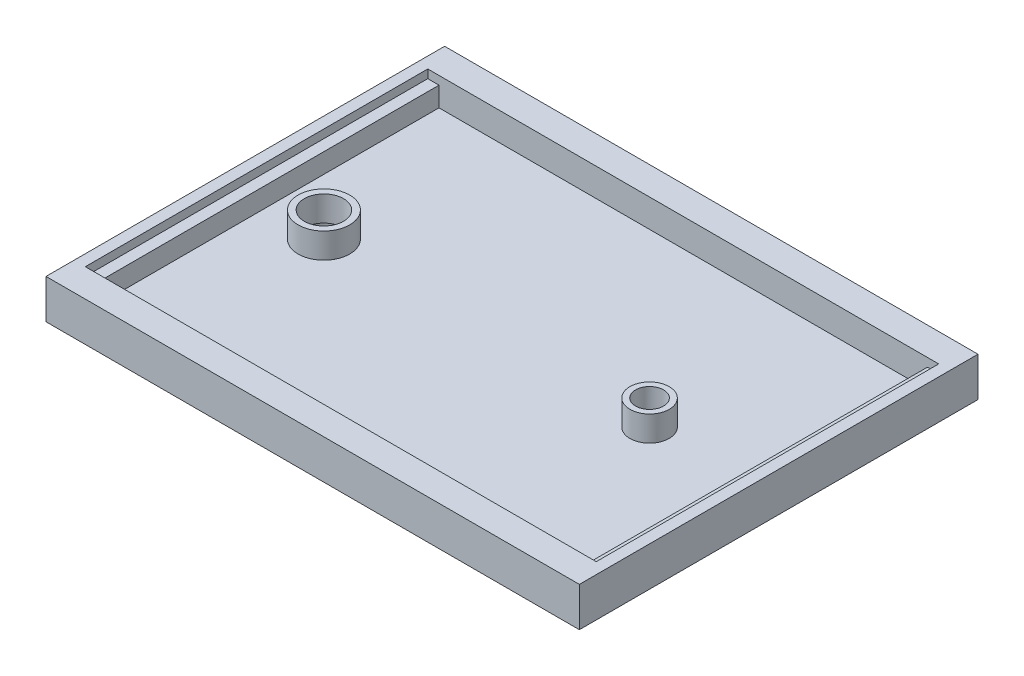
ISO-10303-21;
HEADER;
FILE_DESCRIPTION(('STEP AP214'),'2;1');
FILE_NAME('part.step','',(''),(''),'','','');
FILE_SCHEMA(('AUTOMOTIVE_DESIGN { 1 0 10303 214 1 1 1 1 }'));
ENDSEC;
DATA;
#1=APPLICATION_CONTEXT('core data for automotive mechanical design processes');
#2=APPLICATION_PROTOCOL_DEFINITION('international standard','automotive_design',2000,#1);
#3=PRODUCT_CONTEXT('',#1,'mechanical');
#4=PRODUCT('Part','Part','',(#3));
#5=PRODUCT_RELATED_PRODUCT_CATEGORY('part','',(#4));
#6=PRODUCT_DEFINITION_FORMATION('','',#4);
#7=PRODUCT_DEFINITION_CONTEXT('part definition',#1,'design');
#8=PRODUCT_DEFINITION('design','',#6,#7);
#9=PRODUCT_DEFINITION_SHAPE('','',#8);
#10=(LENGTH_UNIT() NAMED_UNIT(*) SI_UNIT(.MILLI.,.METRE.));
#11=(NAMED_UNIT(*) PLANE_ANGLE_UNIT() SI_UNIT($,.RADIAN.));
#12=(NAMED_UNIT(*) SI_UNIT($,.STERADIAN.) SOLID_ANGLE_UNIT());
#13=UNCERTAINTY_MEASURE_WITH_UNIT(LENGTH_MEASURE(1.E-05),#10,'distance_accuracy_value','');
#14=(GEOMETRIC_REPRESENTATION_CONTEXT(3) GLOBAL_UNCERTAINTY_ASSIGNED_CONTEXT((#13)) GLOBAL_UNIT_ASSIGNED_CONTEXT((#10,
#11,#12)) REPRESENTATION_CONTEXT('',''));
#15=CARTESIAN_POINT('',(0.,0.,0.));
#16=DIRECTION('',(0.,0.,1.));
#17=DIRECTION('',(1.,0.,0.));
#18=AXIS2_PLACEMENT_3D('',#15,#16,#17);
#19=CARTESIAN_POINT('',(-33.5,-0.5,0.));
#20=DIRECTION('',(0.,1.,0.));
#21=DIRECTION('',(0.,0.,1.));
#22=AXIS2_PLACEMENT_3D('',#19,#20,#21);
#23=PLANE('',#22);
#24=CARTESIAN_POINT('',(-33.5,-0.5,0.));
#25=DIRECTION('',(0.,1.,0.));
#26=DIRECTION('',(0.,0.,1.));
#27=AXIS2_PLACEMENT_3D('',#24,#25,#26);
#28=CIRCLE('',#27,4.6);
#29=CARTESIAN_POINT('',(-33.5,-0.5,4.6));
#30=VERTEX_POINT('',#29);
#31=EDGE_CURVE('E12',#30,#30,#28,.T.);
#32=ORIENTED_EDGE('',*,*,#31,.T.);
#33=EDGE_LOOP('',(#32));
#34=FACE_BOUND('',#33,.T.);
#35=CARTESIAN_POINT('',(-33.5,-0.5,0.));
#36=DIRECTION('',(0.,1.,0.));
#37=DIRECTION('',(0.,0.,1.));
#38=AXIS2_PLACEMENT_3D('',#35,#36,#37);
#39=CIRCLE('',#38,3.5);
#40=CARTESIAN_POINT('',(-33.5,-0.5,3.5));
#41=VERTEX_POINT('',#40);
#42=EDGE_CURVE('E107',#41,#41,#39,.T.);
#43=ORIENTED_EDGE('',*,*,#42,.F.);
#44=EDGE_LOOP('',(#43));
#45=FACE_BOUND('',#44,.T.);
#46=ADVANCED_FACE('F93',(#34,#45),#23,.T.);
#47=CARTESIAN_POINT('',(-33.5,-5.,0.));
#48=DIRECTION('',(0.,1.,0.));
#49=DIRECTION('',(0.,0.,1.));
#50=AXIS2_PLACEMENT_3D('',#47,#48,#49);
#51=PLANE('',#50);
#52=CARTESIAN_POINT('',(-33.5,-5.,0.));
#53=DIRECTION('',(0.,1.,0.));
#54=DIRECTION('',(0.,0.,1.));
#55=AXIS2_PLACEMENT_3D('',#52,#53,#54);
#56=CIRCLE('',#55,4.6);
#57=CARTESIAN_POINT('',(-33.5,-5.,4.6));
#58=VERTEX_POINT('',#57);
#59=EDGE_CURVE('E97',#58,#58,#56,.T.);
#60=ORIENTED_EDGE('',*,*,#59,.F.);
#61=EDGE_LOOP('',(#60));
#62=FACE_BOUND('',#61,.T.);
#63=CARTESIAN_POINT('',(-33.5,-5.,0.));
#64=DIRECTION('',(0.,1.,0.));
#65=DIRECTION('',(0.,0.,1.));
#66=AXIS2_PLACEMENT_3D('',#63,#64,#65);
#67=CIRCLE('',#66,3.5);
#68=CARTESIAN_POINT('',(-33.5,-5.,3.5));
#69=VERTEX_POINT('',#68);
#70=EDGE_CURVE('E109',#69,#69,#67,.T.);
#71=ORIENTED_EDGE('',*,*,#70,.T.);
#72=EDGE_LOOP('',(#71));
#73=FACE_BOUND('',#72,.T.);
#74=ADVANCED_FACE('F122',(#62,#73),#51,.F.);
#75=CARTESIAN_POINT('',(-33.5,-0.5,0.));
#76=DIRECTION('',(0.,-1.,0.));
#77=DIRECTION('',(0.,0.,-1.));
#78=AXIS2_PLACEMENT_3D('',#75,#76,#77);
#79=CYLINDRICAL_SURFACE('',#78,4.6);
#80=ORIENTED_EDGE('',*,*,#31,.F.);
#81=EDGE_LOOP('',(#80));
#82=FACE_BOUND('',#81,.T.);
#83=ORIENTED_EDGE('',*,*,#59,.T.);
#84=EDGE_LOOP('',(#83));
#85=FACE_BOUND('',#84,.T.);
#86=ADVANCED_FACE('F95',(#82,#85),#79,.T.);
#87=CARTESIAN_POINT('',(-33.5,-0.5,0.));
#88=DIRECTION('',(0.,-1.,0.));
#89=DIRECTION('',(0.,0.,-1.));
#90=AXIS2_PLACEMENT_3D('',#87,#88,#89);
#91=CYLINDRICAL_SURFACE('',#90,3.5);
#92=ORIENTED_EDGE('',*,*,#42,.T.);
#93=EDGE_LOOP('',(#92));
#94=FACE_BOUND('',#93,.T.);
#95=ORIENTED_EDGE('',*,*,#70,.F.);
#96=EDGE_LOOP('',(#95));
#97=FACE_BOUND('',#96,.T.);
#98=ADVANCED_FACE('F118',(#94,#97),#91,.F.);
#99=CLOSED_SHELL('',(#46,#74,#86,#98));
#100=MANIFOLD_SOLID_BREP('B2',#99);
#101=CARTESIAN_POINT('',(-43.5,-5.,30.5));
#102=DIRECTION('',(0.,-1.,0.));
#103=DIRECTION('',(0.,0.,-1.));
#104=AXIS2_PLACEMENT_3D('',#101,#102,#103);
#105=PLANE('',#104);
#106=DIRECTION('',(-1.,0.,0.));
#107=VECTOR('',#106,1.);
#108=CARTESIAN_POINT('',(-43.5,-5.,-30.5));
#109=LINE('',#108,#107);
#110=CARTESIAN_POINT('',(43.5,-5.,-30.5));
#111=VERTEX_POINT('',#110);
#112=CARTESIAN_POINT('',(-43.5,-5.,-30.5));
#113=VERTEX_POINT('',#112);
#114=EDGE_CURVE('E351',#111,#113,#109,.T.);
#115=ORIENTED_EDGE('',*,*,#114,.T.);
#116=DIRECTION('',(0.,0.,-1.));
#117=VECTOR('',#116,1.);
#118=CARTESIAN_POINT('',(-43.5,-5.,30.5));
#119=LINE('',#118,#117);
#120=CARTESIAN_POINT('',(-43.5,-5.,30.5));
#121=VERTEX_POINT('',#120);
#122=EDGE_CURVE('E374',#121,#113,#119,.T.);
#123=ORIENTED_EDGE('',*,*,#122,.F.);
#124=DIRECTION('',(-1.,0.,0.));
#125=VECTOR('',#124,1.);
#126=CARTESIAN_POINT('',(-43.5,-5.,30.5));
#127=LINE('',#126,#125);
#128=CARTESIAN_POINT('',(43.5,-5.,30.5));
#129=VERTEX_POINT('',#128);
#130=EDGE_CURVE('E323',#129,#121,#127,.T.);
#131=ORIENTED_EDGE('',*,*,#130,.F.);
#132=DIRECTION('',(0.,0.,-1.));
#133=VECTOR('',#132,1.);
#134=CARTESIAN_POINT('',(43.5,-5.,30.5));
#135=LINE('',#134,#133);
#136=EDGE_CURVE('E378',#129,#111,#135,.T.);
#137=ORIENTED_EDGE('',*,*,#136,.T.);
#138=EDGE_LOOP('',(#115,#123,#131,#137));
#139=FACE_BOUND('',#138,.T.);
#140=CARTESIAN_POINT('',(-33.5,-5.,0.));
#141=DIRECTION('',(0.,-1.,0.));
#142=DIRECTION('',(0.,0.,-1.));
#143=AXIS2_PLACEMENT_3D('',#140,#141,#142);
#144=CIRCLE('',#143,4.6);
#145=CARTESIAN_POINT('',(-33.5,-5.,-4.6));
#146=VERTEX_POINT('',#145);
#147=EDGE_CURVE('E292',#146,#146,#144,.T.);
#148=ORIENTED_EDGE('',*,*,#147,.T.);
#149=EDGE_LOOP('',(#148));
#150=FACE_BOUND('',#149,.T.);
#151=CARTESIAN_POINT('',(24.5,-5.,0.));
#152=DIRECTION('',(0.,-1.,0.));
#153=DIRECTION('',(0.,0.,-1.));
#154=AXIS2_PLACEMENT_3D('',#151,#152,#153);
#155=CIRCLE('',#154,3.5);
#156=CARTESIAN_POINT('',(24.5,-5.,-3.5));
#157=VERTEX_POINT('',#156);
#158=EDGE_CURVE('E91',#157,#157,#155,.F.);
#159=ORIENTED_EDGE('',*,*,#158,.F.);
#160=EDGE_LOOP('',(#159));
#161=FACE_BOUND('',#160,.T.);
#162=ADVANCED_FACE('F163',(#139,#150,#161),#105,.F.);
#163=CARTESIAN_POINT('',(-47.5,-7.,30.5));
#164=DIRECTION('',(1.,0.,0.));
#165=DIRECTION('',(0.,0.,-1.));
#166=AXIS2_PLACEMENT_3D('',#163,#164,#165);
#167=PLANE('',#166);
#168=DIRECTION('',(0.,0.,-1.));
#169=VECTOR('',#168,1.);
#170=CARTESIAN_POINT('',(-47.5,0.,30.5));
#171=LINE('',#170,#169);
#172=CARTESIAN_POINT('',(-47.5,0.,35.5));
#173=VERTEX_POINT('',#172);
#174=CARTESIAN_POINT('',(-47.5,0.,-35.5));
#175=VERTEX_POINT('',#174);
#176=EDGE_CURVE('E173',#173,#175,#171,.T.);
#177=ORIENTED_EDGE('',*,*,#176,.T.);
#178=DIRECTION('',(0.,-1.,0.));
#179=VECTOR('',#178,1.);
#180=CARTESIAN_POINT('',(-47.5,0.,-35.5));
#181=LINE('',#180,#179);
#182=CARTESIAN_POINT('',(-47.5,-7.,-35.5));
#183=VERTEX_POINT('',#182);
#184=EDGE_CURVE('E273',#175,#183,#181,.T.);
#185=ORIENTED_EDGE('',*,*,#184,.T.);
#186=DIRECTION('',(0.,0.,-1.));
#187=VECTOR('',#186,1.);
#188=CARTESIAN_POINT('',(-47.5,-7.,30.5));
#189=LINE('',#188,#187);
#190=CARTESIAN_POINT('',(-47.5,-7.,35.5));
#191=VERTEX_POINT('',#190);
#192=EDGE_CURVE('E395',#191,#183,#189,.T.);
#193=ORIENTED_EDGE('',*,*,#192,.F.);
#194=DIRECTION('',(0.,-1.,0.));
#195=VECTOR('',#194,1.);
#196=CARTESIAN_POINT('',(-47.5,0.,35.5));
#197=LINE('',#196,#195);
#198=EDGE_CURVE('E295',#173,#191,#197,.T.);
#199=ORIENTED_EDGE('',*,*,#198,.F.);
#200=EDGE_LOOP('',(#177,#185,#193,#199));
#201=FACE_BOUND('',#200,.T.);
#202=ADVANCED_FACE('F165',(#201),#167,.F.);
#203=CARTESIAN_POINT('',(-47.5,-7.,30.5));
#204=DIRECTION('',(0.,1.,0.));
#205=DIRECTION('',(-1.,0.,0.));
#206=AXIS2_PLACEMENT_3D('',#203,#204,#205);
#207=PLANE('',#206);
#208=CARTESIAN_POINT('',(-33.5,-7.,0.));
#209=DIRECTION('',(0.,-1.,0.));
#210=DIRECTION('',(1.,0.,0.));
#211=AXIS2_PLACEMENT_3D('',#208,#209,#210);
#212=CIRCLE('',#211,4.6);
#213=CARTESIAN_POINT('',(-28.9,-7.,0.));
#214=VERTEX_POINT('',#213);
#215=EDGE_CURVE('E401',#214,#214,#212,.T.);
#216=ORIENTED_EDGE('',*,*,#215,.F.);
#217=EDGE_LOOP('',(#216));
#218=FACE_BOUND('',#217,.T.);
#219=CARTESIAN_POINT('',(24.5,-6.99999999999999,0.));
#220=DIRECTION('',(0.,-1.,0.));
#221=DIRECTION('',(1.,0.,0.));
#222=AXIS2_PLACEMENT_3D('',#219,#220,#221);
#223=CIRCLE('',#222,2.5);
#224=CARTESIAN_POINT('',(27.,-6.99999999999999,0.));
#225=VERTEX_POINT('',#224);
#226=EDGE_CURVE('E408',#225,#225,#223,.T.);
#227=ORIENTED_EDGE('',*,*,#226,.F.);
#228=EDGE_LOOP('',(#227));
#229=FACE_BOUND('',#228,.T.);
#230=ORIENTED_EDGE('',*,*,#192,.T.);
#231=DIRECTION('',(1.,0.,0.));
#232=VECTOR('',#231,1.);
#233=CARTESIAN_POINT('',(-47.5,-7.,-35.5));
#234=LINE('',#233,#232);
#235=CARTESIAN_POINT('',(47.5,-6.99999999999999,-35.5));
#236=VERTEX_POINT('',#235);
#237=EDGE_CURVE('E279',#183,#236,#234,.T.);
#238=ORIENTED_EDGE('',*,*,#237,.T.);
#239=DIRECTION('',(0.,0.,-1.));
#240=VECTOR('',#239,1.);
#241=CARTESIAN_POINT('',(47.5,-6.99999999999999,30.5));
#242=LINE('',#241,#240);
#243=CARTESIAN_POINT('',(47.5,-6.99999999999999,35.5));
#244=VERTEX_POINT('',#243);
#245=EDGE_CURVE('E263',#244,#236,#242,.T.);
#246=ORIENTED_EDGE('',*,*,#245,.F.);
#247=DIRECTION('',(1.,0.,0.));
#248=VECTOR('',#247,1.);
#249=CARTESIAN_POINT('',(-47.5,-7.,35.5));
#250=LINE('',#249,#248);
#251=EDGE_CURVE('E299',#191,#244,#250,.T.);
#252=ORIENTED_EDGE('',*,*,#251,.F.);
#253=EDGE_LOOP('',(#230,#238,#246,#252));
#254=FACE_BOUND('',#253,.T.);
#255=ADVANCED_FACE('F449',(#218,#229,#254),#207,.F.);
#256=CARTESIAN_POINT('',(47.5,-4.99999999999999,30.5));
#257=DIRECTION('',(-1.,0.,0.));
#258=DIRECTION('',(0.,0.,1.));
#259=AXIS2_PLACEMENT_3D('',#256,#257,#258);
#260=PLANE('',#259);
#261=ORIENTED_EDGE('',*,*,#245,.T.);
#262=DIRECTION('',(0.,1.,0.));
#263=VECTOR('',#262,1.);
#264=CARTESIAN_POINT('',(47.5,-6.99999999999999,-35.5));
#265=LINE('',#264,#263);
#266=CARTESIAN_POINT('',(47.5,0.,-35.5));
#267=VERTEX_POINT('',#266);
#268=EDGE_CURVE('E270',#236,#267,#265,.T.);
#269=ORIENTED_EDGE('',*,*,#268,.T.);
#270=DIRECTION('',(0.,0.,-1.));
#271=VECTOR('',#270,1.);
#272=CARTESIAN_POINT('',(47.5,0.,30.5));
#273=LINE('',#272,#271);
#274=CARTESIAN_POINT('',(47.5,0.,35.5));
#275=VERTEX_POINT('',#274);
#276=EDGE_CURVE('E250',#275,#267,#273,.T.);
#277=ORIENTED_EDGE('',*,*,#276,.F.);
#278=DIRECTION('',(0.,1.,0.));
#279=VECTOR('',#278,1.);
#280=CARTESIAN_POINT('',(47.5,-6.99999999999999,35.5));
#281=LINE('',#280,#279);
#282=EDGE_CURVE('E303',#244,#275,#281,.T.);
#283=ORIENTED_EDGE('',*,*,#282,.F.);
#284=EDGE_LOOP('',(#261,#269,#277,#283));
#285=FACE_BOUND('',#284,.T.);
#286=ADVANCED_FACE('F277',(#285),#260,.F.);
#287=CARTESIAN_POINT('',(47.5,0.,30.5));
#288=DIRECTION('',(0.,-1.,0.));
#289=DIRECTION('',(1.,0.,0.));
#290=AXIS2_PLACEMENT_3D('',#287,#288,#289);
#291=PLANE('',#290);
#292=DIRECTION('',(-1.,0.,0.));
#293=VECTOR('',#292,1.);
#294=CARTESIAN_POINT('',(47.5,0.,-35.5));
#295=LINE('',#294,#293);
#296=EDGE_CURVE('E254',#267,#175,#295,.T.);
#297=ORIENTED_EDGE('',*,*,#296,.T.);
#298=ORIENTED_EDGE('',*,*,#176,.F.);
#299=DIRECTION('',(-1.,0.,0.));
#300=VECTOR('',#299,1.);
#301=CARTESIAN_POINT('',(47.5,0.,35.5));
#302=LINE('',#301,#300);
#303=EDGE_CURVE('E257',#275,#173,#302,.T.);
#304=ORIENTED_EDGE('',*,*,#303,.F.);
#305=ORIENTED_EDGE('',*,*,#276,.T.);
#306=EDGE_LOOP('',(#297,#298,#304,#305));
#307=FACE_BOUND('',#306,.T.);
#308=DIRECTION('',(0.,0.,-1.));
#309=VECTOR('',#308,1.);
#310=CARTESIAN_POINT('',(-45.5,0.,30.5));
#311=LINE('',#310,#309);
#312=CARTESIAN_POINT('',(-45.5,0.,30.5));
#313=VERTEX_POINT('',#312);
#314=CARTESIAN_POINT('',(-45.5,0.,-30.5));
#315=VERTEX_POINT('',#314);
#316=EDGE_CURVE('E339',#313,#315,#311,.T.);
#317=ORIENTED_EDGE('',*,*,#316,.T.);
#318=DIRECTION('',(-1.,0.,0.));
#319=VECTOR('',#318,1.);
#320=CARTESIAN_POINT('',(47.5,0.,-30.5));
#321=LINE('',#320,#319);
#322=CARTESIAN_POINT('',(45.5,0.,-30.5));
#323=VERTEX_POINT('',#322);
#324=EDGE_CURVE('E275',#323,#315,#321,.T.);
#325=ORIENTED_EDGE('',*,*,#324,.F.);
#326=DIRECTION('',(0.,0.,-1.));
#327=VECTOR('',#326,1.);
#328=CARTESIAN_POINT('',(45.5,0.,30.5));
#329=LINE('',#328,#327);
#330=CARTESIAN_POINT('',(45.5,0.,30.5));
#331=VERTEX_POINT('',#330);
#332=EDGE_CURVE('E264',#331,#323,#329,.T.);
#333=ORIENTED_EDGE('',*,*,#332,.F.);
#334=DIRECTION('',(-1.,0.,0.));
#335=VECTOR('',#334,1.);
#336=CARTESIAN_POINT('',(47.5,0.,30.5));
#337=LINE('',#336,#335);
#338=EDGE_CURVE('E289',#331,#313,#337,.T.);
#339=ORIENTED_EDGE('',*,*,#338,.T.);
#340=EDGE_LOOP('',(#317,#325,#333,#339));
#341=FACE_BOUND('',#340,.T.);
#342=ADVANCED_FACE('F252',(#307,#341),#291,.F.);
#343=CARTESIAN_POINT('',(45.5,0.,30.5));
#344=DIRECTION('',(1.,0.,0.));
#345=DIRECTION('',(0.,0.,-1.));
#346=AXIS2_PLACEMENT_3D('',#343,#344,#345);
#347=PLANE('',#346);
#348=DIRECTION('',(0.,-1.,0.));
#349=VECTOR('',#348,1.);
#350=CARTESIAN_POINT('',(45.5,0.,-30.5));
#351=LINE('',#350,#349);
#352=CARTESIAN_POINT('',(45.5,-1.5,-30.5));
#353=VERTEX_POINT('',#352);
#354=EDGE_CURVE('E306',#323,#353,#351,.T.);
#355=ORIENTED_EDGE('',*,*,#354,.T.);
#356=DIRECTION('',(0.,0.,-1.));
#357=VECTOR('',#356,1.);
#358=CARTESIAN_POINT('',(45.5,-1.5,30.5));
#359=LINE('',#358,#357);
#360=CARTESIAN_POINT('',(45.5,-1.5,30.5));
#361=VERTEX_POINT('',#360);
#362=EDGE_CURVE('E386',#361,#353,#359,.T.);
#363=ORIENTED_EDGE('',*,*,#362,.F.);
#364=DIRECTION('',(0.,-1.,0.));
#365=VECTOR('',#364,1.);
#366=CARTESIAN_POINT('',(45.5,0.,30.5));
#367=LINE('',#366,#365);
#368=EDGE_CURVE('E310',#331,#361,#367,.T.);
#369=ORIENTED_EDGE('',*,*,#368,.F.);
#370=ORIENTED_EDGE('',*,*,#332,.T.);
#371=EDGE_LOOP('',(#355,#363,#369,#370));
#372=FACE_BOUND('',#371,.T.);
#373=ADVANCED_FACE('F462',(#372),#347,.F.);
#374=CARTESIAN_POINT('',(45.5,-1.5,30.5));
#375=DIRECTION('',(0.,-1.,0.));
#376=DIRECTION('',(0.,0.,-1.));
#377=AXIS2_PLACEMENT_3D('',#374,#375,#376);
#378=PLANE('',#377);
#379=DIRECTION('',(-1.,0.,0.));
#380=VECTOR('',#379,1.);
#381=CARTESIAN_POINT('',(45.5,-1.5,-30.5));
#382=LINE('',#381,#380);
#383=CARTESIAN_POINT('',(43.5,-1.5,-30.5));
#384=VERTEX_POINT('',#383);
#385=EDGE_CURVE('E343',#353,#384,#382,.T.);
#386=ORIENTED_EDGE('',*,*,#385,.T.);
#387=DIRECTION('',(0.,0.,-1.));
#388=VECTOR('',#387,1.);
#389=CARTESIAN_POINT('',(43.5,-1.5,30.5));
#390=LINE('',#389,#388);
#391=CARTESIAN_POINT('',(43.5,-1.5,30.5));
#392=VERTEX_POINT('',#391);
#393=EDGE_CURVE('E382',#392,#384,#390,.T.);
#394=ORIENTED_EDGE('',*,*,#393,.F.);
#395=DIRECTION('',(-1.,0.,0.));
#396=VECTOR('',#395,1.);
#397=CARTESIAN_POINT('',(45.5,-1.5,30.5));
#398=LINE('',#397,#396);
#399=EDGE_CURVE('E314',#361,#392,#398,.T.);
#400=ORIENTED_EDGE('',*,*,#399,.F.);
#401=ORIENTED_EDGE('',*,*,#362,.T.);
#402=EDGE_LOOP('',(#386,#394,#400,#401));
#403=FACE_BOUND('',#402,.T.);
#404=ADVANCED_FACE('F458',(#403),#378,.F.);
#405=CARTESIAN_POINT('',(43.5,-1.5,30.5));
#406=DIRECTION('',(1.,0.,0.));
#407=DIRECTION('',(0.,0.,-1.));
#408=AXIS2_PLACEMENT_3D('',#405,#406,#407);
#409=PLANE('',#408);
#410=DIRECTION('',(0.,-1.,0.));
#411=VECTOR('',#410,1.);
#412=CARTESIAN_POINT('',(43.5,-1.5,-30.5));
#413=LINE('',#412,#411);
#414=EDGE_CURVE('E347',#384,#111,#413,.T.);
#415=ORIENTED_EDGE('',*,*,#414,.T.);
#416=ORIENTED_EDGE('',*,*,#136,.F.);
#417=DIRECTION('',(0.,-1.,0.));
#418=VECTOR('',#417,1.);
#419=CARTESIAN_POINT('',(43.5,-1.5,30.5));
#420=LINE('',#419,#418);
#421=EDGE_CURVE('E319',#392,#129,#420,.T.);
#422=ORIENTED_EDGE('',*,*,#421,.F.);
#423=ORIENTED_EDGE('',*,*,#393,.T.);
#424=EDGE_LOOP('',(#415,#416,#422,#423));
#425=FACE_BOUND('',#424,.T.);
#426=ADVANCED_FACE('F455',(#425),#409,.F.);
#427=CARTESIAN_POINT('',(-43.5,-1.5,30.5));
#428=DIRECTION('',(-1.,0.,0.));
#429=DIRECTION('',(0.,0.,1.));
#430=AXIS2_PLACEMENT_3D('',#427,#428,#429);
#431=PLANE('',#430);
#432=DIRECTION('',(0.,1.,0.));
#433=VECTOR('',#432,1.);
#434=CARTESIAN_POINT('',(-43.5,-1.5,-30.5));
#435=LINE('',#434,#433);
#436=CARTESIAN_POINT('',(-43.5,-1.5,-30.5));
#437=VERTEX_POINT('',#436);
#438=EDGE_CURVE('E355',#113,#437,#435,.T.);
#439=ORIENTED_EDGE('',*,*,#438,.T.);
#440=DIRECTION('',(0.,0.,-1.));
#441=VECTOR('',#440,1.);
#442=CARTESIAN_POINT('',(-43.5,-1.5,30.5));
#443=LINE('',#442,#441);
#444=CARTESIAN_POINT('',(-43.5,-1.5,30.5));
#445=VERTEX_POINT('',#444);
#446=EDGE_CURVE('E370',#445,#437,#443,.T.);
#447=ORIENTED_EDGE('',*,*,#446,.F.);
#448=DIRECTION('',(0.,1.,0.));
#449=VECTOR('',#448,1.);
#450=CARTESIAN_POINT('',(-43.5,-1.5,30.5));
#451=LINE('',#450,#449);
#452=EDGE_CURVE('E327',#121,#445,#451,.T.);
#453=ORIENTED_EDGE('',*,*,#452,.F.);
#454=ORIENTED_EDGE('',*,*,#122,.T.);
#455=EDGE_LOOP('',(#439,#447,#453,#454));
#456=FACE_BOUND('',#455,.T.);
#457=ADVANCED_FACE('F453',(#456),#431,.F.);
#458=CARTESIAN_POINT('',(-45.5,-1.5,30.5));
#459=DIRECTION('',(0.,-1.,0.));
#460=DIRECTION('',(0.,0.,-1.));
#461=AXIS2_PLACEMENT_3D('',#458,#459,#460);
#462=PLANE('',#461);
#463=DIRECTION('',(-1.,0.,0.));
#464=VECTOR('',#463,1.);
#465=CARTESIAN_POINT('',(-45.5,-1.5,-30.5));
#466=LINE('',#465,#464);
#467=CARTESIAN_POINT('',(-45.5,-1.5,-30.5));
#468=VERTEX_POINT('',#467);
#469=EDGE_CURVE('E359',#437,#468,#466,.T.);
#470=ORIENTED_EDGE('',*,*,#469,.T.);
#471=DIRECTION('',(0.,0.,-1.));
#472=VECTOR('',#471,1.);
#473=CARTESIAN_POINT('',(-45.5,-1.5,30.5));
#474=LINE('',#473,#472);
#475=CARTESIAN_POINT('',(-45.5,-1.5,30.5));
#476=VERTEX_POINT('',#475);
#477=EDGE_CURVE('E180',#476,#468,#474,.T.);
#478=ORIENTED_EDGE('',*,*,#477,.F.);
#479=DIRECTION('',(-1.,0.,0.));
#480=VECTOR('',#479,1.);
#481=CARTESIAN_POINT('',(-45.5,-1.5,30.5));
#482=LINE('',#481,#480);
#483=EDGE_CURVE('E331',#445,#476,#482,.T.);
#484=ORIENTED_EDGE('',*,*,#483,.F.);
#485=ORIENTED_EDGE('',*,*,#446,.T.);
#486=EDGE_LOOP('',(#470,#478,#484,#485));
#487=FACE_BOUND('',#486,.T.);
#488=ADVANCED_FACE('F496',(#487),#462,.F.);
#489=CARTESIAN_POINT('',(-45.5,0.,30.5));
#490=DIRECTION('',(-1.,0.,0.));
#491=DIRECTION('',(0.,0.,1.));
#492=AXIS2_PLACEMENT_3D('',#489,#490,#491);
#493=PLANE('',#492);
#494=DIRECTION('',(0.,1.,0.));
#495=VECTOR('',#494,1.);
#496=CARTESIAN_POINT('',(-45.5,0.,-30.5));
#497=LINE('',#496,#495);
#498=EDGE_CURVE('E315',#468,#315,#497,.T.);
#499=ORIENTED_EDGE('',*,*,#498,.T.);
#500=ORIENTED_EDGE('',*,*,#316,.F.);
#501=DIRECTION('',(0.,1.,0.));
#502=VECTOR('',#501,1.);
#503=CARTESIAN_POINT('',(-45.5,0.,30.5));
#504=LINE('',#503,#502);
#505=EDGE_CURVE('E335',#476,#313,#504,.T.);
#506=ORIENTED_EDGE('',*,*,#505,.F.);
#507=ORIENTED_EDGE('',*,*,#477,.T.);
#508=EDGE_LOOP('',(#499,#500,#506,#507));
#509=FACE_BOUND('',#508,.T.);
#510=ADVANCED_FACE('F490',(#509),#493,.F.);
#511=CARTESIAN_POINT('',(0.,0.,30.5));
#512=DIRECTION('',(0.,0.,1.));
#513=DIRECTION('',(1.,0.,0.));
#514=AXIS2_PLACEMENT_3D('',#511,#512,#513);
#515=PLANE('',#514);
#516=ORIENTED_EDGE('',*,*,#338,.F.);
#517=ORIENTED_EDGE('',*,*,#368,.T.);
#518=ORIENTED_EDGE('',*,*,#399,.T.);
#519=ORIENTED_EDGE('',*,*,#421,.T.);
#520=ORIENTED_EDGE('',*,*,#130,.T.);
#521=ORIENTED_EDGE('',*,*,#452,.T.);
#522=ORIENTED_EDGE('',*,*,#483,.T.);
#523=ORIENTED_EDGE('',*,*,#505,.T.);
#524=EDGE_LOOP('',(#516,#517,#518,#519,#520,#521,#522,#523));
#525=FACE_BOUND('',#524,.T.);
#526=ADVANCED_FACE('F482',(#525),#515,.F.);
#527=CARTESIAN_POINT('',(0.,0.,35.5));
#528=DIRECTION('',(0.,0.,1.));
#529=DIRECTION('',(1.,0.,0.));
#530=AXIS2_PLACEMENT_3D('',#527,#528,#529);
#531=PLANE('',#530);
#532=ORIENTED_EDGE('',*,*,#303,.T.);
#533=ORIENTED_EDGE('',*,*,#198,.T.);
#534=ORIENTED_EDGE('',*,*,#251,.T.);
#535=ORIENTED_EDGE('',*,*,#282,.T.);
#536=EDGE_LOOP('',(#532,#533,#534,#535));
#537=FACE_BOUND('',#536,.T.);
#538=ADVANCED_FACE('F480',(#537),#531,.T.);
#539=CARTESIAN_POINT('',(0.,0.,-35.5));
#540=DIRECTION('',(0.,0.,-1.));
#541=DIRECTION('',(1.,0.,0.));
#542=AXIS2_PLACEMENT_3D('',#539,#540,#541);
#543=PLANE('',#542);
#544=ORIENTED_EDGE('',*,*,#296,.F.);
#545=ORIENTED_EDGE('',*,*,#268,.F.);
#546=ORIENTED_EDGE('',*,*,#237,.F.);
#547=ORIENTED_EDGE('',*,*,#184,.F.);
#548=EDGE_LOOP('',(#544,#545,#546,#547));
#549=FACE_BOUND('',#548,.T.);
#550=ADVANCED_FACE('F268',(#549),#543,.T.);
#551=CARTESIAN_POINT('',(0.,0.,-30.5));
#552=DIRECTION('',(0.,0.,-1.));
#553=DIRECTION('',(1.,0.,0.));
#554=AXIS2_PLACEMENT_3D('',#551,#552,#553);
#555=PLANE('',#554);
#556=ORIENTED_EDGE('',*,*,#498,.F.);
#557=ORIENTED_EDGE('',*,*,#469,.F.);
#558=ORIENTED_EDGE('',*,*,#438,.F.);
#559=ORIENTED_EDGE('',*,*,#114,.F.);
#560=ORIENTED_EDGE('',*,*,#414,.F.);
#561=ORIENTED_EDGE('',*,*,#385,.F.);
#562=ORIENTED_EDGE('',*,*,#354,.F.);
#563=ORIENTED_EDGE('',*,*,#324,.T.);
#564=EDGE_LOOP('',(#556,#557,#558,#559,#560,#561,#562,#563));
#565=FACE_BOUND('',#564,.T.);
#566=ADVANCED_FACE('F488',(#565),#555,.F.);
#567=CARTESIAN_POINT('',(24.5,0.,0.));
#568=DIRECTION('',(0.,-1.,0.));
#569=DIRECTION('',(1.,0.,0.));
#570=AXIS2_PLACEMENT_3D('',#567,#568,#569);
#571=CYLINDRICAL_SURFACE('',#570,2.5);
#572=ORIENTED_EDGE('',*,*,#226,.T.);
#573=EDGE_LOOP('',(#572));
#574=FACE_BOUND('',#573,.T.);
#575=CARTESIAN_POINT('',(24.5,-0.5,0.));
#576=DIRECTION('',(0.,1.,0.));
#577=DIRECTION('',(0.,0.,1.));
#578=AXIS2_PLACEMENT_3D('',#575,#576,#577);
#579=CIRCLE('',#578,2.5);
#580=CARTESIAN_POINT('',(24.5,-0.5,2.5));
#581=VERTEX_POINT('',#580);
#582=EDGE_CURVE('E421',#581,#581,#579,.T.);
#583=ORIENTED_EDGE('',*,*,#582,.T.);
#584=EDGE_LOOP('',(#583));
#585=FACE_BOUND('',#584,.T.);
#586=ADVANCED_FACE('F428',(#574,#585),#571,.F.);
#587=CARTESIAN_POINT('',(-33.5,0.,0.));
#588=DIRECTION('',(0.,-1.,0.));
#589=DIRECTION('',(1.,0.,0.));
#590=AXIS2_PLACEMENT_3D('',#587,#588,#589);
#591=CYLINDRICAL_SURFACE('',#590,4.6);
#592=ORIENTED_EDGE('',*,*,#215,.T.);
#593=EDGE_LOOP('',(#592));
#594=FACE_BOUND('',#593,.T.);
#595=ORIENTED_EDGE('',*,*,#147,.F.);
#596=EDGE_LOOP('',(#595));
#597=FACE_BOUND('',#596,.T.);
#598=ADVANCED_FACE('F433',(#594,#597),#591,.F.);
#599=CARTESIAN_POINT('',(24.5,-0.5,0.));
#600=DIRECTION('',(0.,1.,0.));
#601=DIRECTION('',(0.,0.,1.));
#602=AXIS2_PLACEMENT_3D('',#599,#600,#601);
#603=PLANE('',#602);
#604=CARTESIAN_POINT('',(24.5,-0.5,0.));
#605=DIRECTION('',(0.,1.,0.));
#606=DIRECTION('',(0.,0.,1.));
#607=AXIS2_PLACEMENT_3D('',#604,#605,#606);
#608=CIRCLE('',#607,3.5);
#609=CARTESIAN_POINT('',(24.5,-0.5,3.5));
#610=VERTEX_POINT('',#609);
#611=EDGE_CURVE('E416',#610,#610,#608,.T.);
#612=ORIENTED_EDGE('',*,*,#611,.T.);
#613=EDGE_LOOP('',(#612));
#614=FACE_BOUND('',#613,.T.);
#615=ORIENTED_EDGE('',*,*,#582,.F.);
#616=EDGE_LOOP('',(#615));
#617=FACE_BOUND('',#616,.T.);
#618=ADVANCED_FACE('F430',(#614,#617),#603,.T.);
#619=CARTESIAN_POINT('',(24.5,-0.5,0.));
#620=DIRECTION('',(0.,-1.,0.));
#621=DIRECTION('',(0.,0.,-1.));
#622=AXIS2_PLACEMENT_3D('',#619,#620,#621);
#623=CYLINDRICAL_SURFACE('',#622,3.5);
#624=ORIENTED_EDGE('',*,*,#611,.F.);
#625=EDGE_LOOP('',(#624));
#626=FACE_BOUND('',#625,.T.);
#627=ORIENTED_EDGE('',*,*,#158,.T.);
#628=EDGE_LOOP('',(#627));
#629=FACE_BOUND('',#628,.T.);
#630=ADVANCED_FACE('F432',(#626,#629),#623,.T.);
#631=CLOSED_SHELL('',(#162,#202,#255,#286,#342,#373,#404,#426,#457,#488,#510,#526,#538,#550,
#566,#586,#598,#618,#630));
#632=MANIFOLD_SOLID_BREP('B7',#631);
#633=ADVANCED_BREP_SHAPE_REPRESENTATION('',(#18,#100,#632),#14);
#634=SHAPE_DEFINITION_REPRESENTATION(#9,#633);
ENDSEC;
END-ISO-10303-21;
